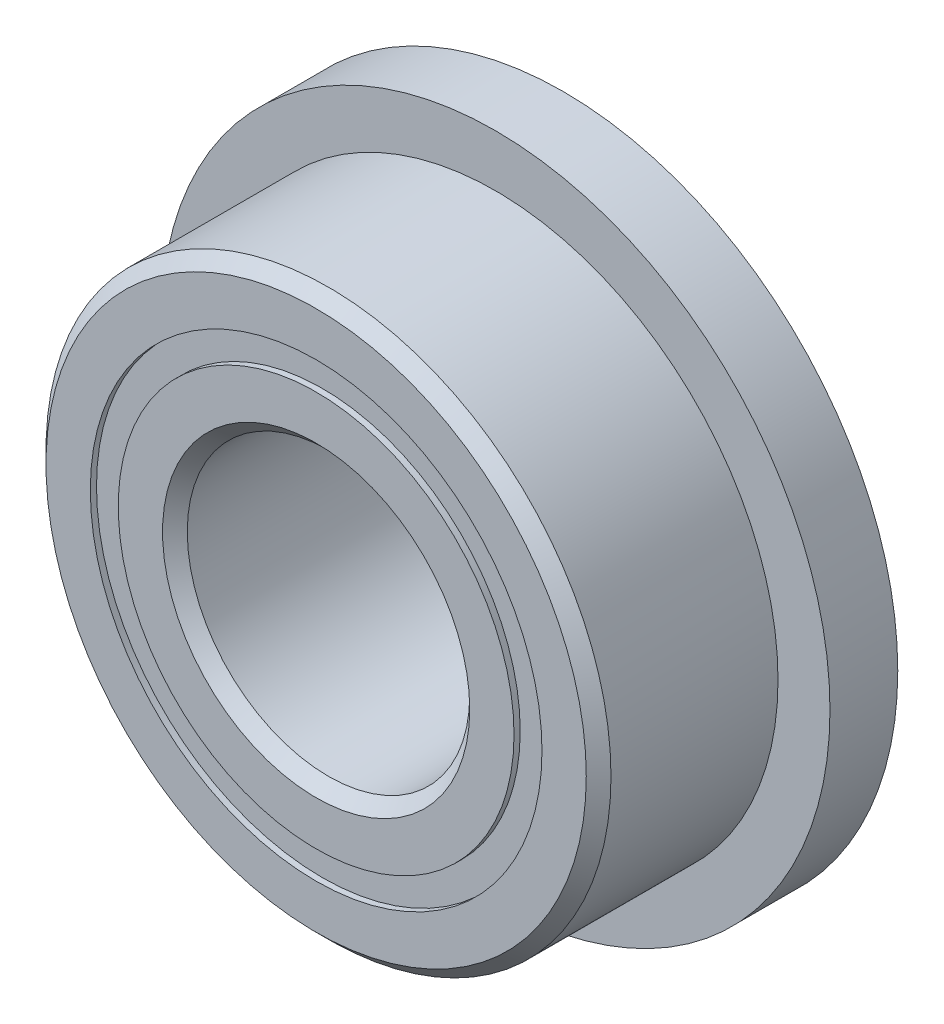
ISO-10303-21;
HEADER;
FILE_DESCRIPTION(('STEP AP214'),'2;1');
FILE_NAME('part.step','',(''),(''),'','','');
FILE_SCHEMA(('AUTOMOTIVE_DESIGN { 1 0 10303 214 1 1 1 1 }'));
ENDSEC;
DATA;
#1=APPLICATION_CONTEXT('core data for automotive mechanical design processes');
#2=APPLICATION_PROTOCOL_DEFINITION('international standard','automotive_design',2000,#1);
#3=PRODUCT_CONTEXT('',#1,'mechanical');
#4=PRODUCT('Part','Part','',(#3));
#5=PRODUCT_RELATED_PRODUCT_CATEGORY('part','',(#4));
#6=PRODUCT_DEFINITION_FORMATION('','',#4);
#7=PRODUCT_DEFINITION_CONTEXT('part definition',#1,'design');
#8=PRODUCT_DEFINITION('design','',#6,#7);
#9=PRODUCT_DEFINITION_SHAPE('','',#8);
#10=(LENGTH_UNIT() NAMED_UNIT(*) SI_UNIT(.MILLI.,.METRE.));
#11=(NAMED_UNIT(*) PLANE_ANGLE_UNIT() SI_UNIT($,.RADIAN.));
#12=(NAMED_UNIT(*) SI_UNIT($,.STERADIAN.) SOLID_ANGLE_UNIT());
#13=UNCERTAINTY_MEASURE_WITH_UNIT(LENGTH_MEASURE(1.E-05),#10,'distance_accuracy_value','');
#14=(GEOMETRIC_REPRESENTATION_CONTEXT(3) GLOBAL_UNCERTAINTY_ASSIGNED_CONTEXT((#13)) GLOBAL_UNIT_ASSIGNED_CONTEXT((#10,
#11,#12)) REPRESENTATION_CONTEXT('',''));
#15=CARTESIAN_POINT('',(0.,0.,0.));
#16=DIRECTION('',(0.,0.,1.));
#17=DIRECTION('',(1.,0.,0.));
#18=AXIS2_PLACEMENT_3D('',#15,#16,#17);
#19=CARTESIAN_POINT('',(0.,2.53825549450549,-1.319609375));
#20=DIRECTION('',(0.,0.,1.));
#21=DIRECTION('',(1.,0.,0.));
#22=AXIS2_PLACEMENT_3D('',#19,#20,#21);
#23=PLANE('',#22);
#24=CARTESIAN_POINT('',(0.,0.,-1.319609375));
#25=DIRECTION('',(0.,0.,1.));
#26=DIRECTION('',(1.,0.,0.));
#27=AXIS2_PLACEMENT_3D('',#24,#25,#26);
#28=CIRCLE('',#27,2.53825549450549);
#29=CARTESIAN_POINT('',(2.53825549450549,0.,-1.319609375));
#30=VERTEX_POINT('',#29);
#31=EDGE_CURVE('E64',#30,#30,#28,.T.);
#32=ORIENTED_EDGE('',*,*,#31,.F.);
#33=EDGE_LOOP('',(#32));
#34=FACE_BOUND('',#33,.T.);
#35=CARTESIAN_POINT('',(0.,0.,-1.319609375));
#36=DIRECTION('',(0.,0.,1.));
#37=DIRECTION('',(1.,0.,0.));
#38=AXIS2_PLACEMENT_3D('',#35,#36,#37);
#39=CIRCLE('',#38,2.2242445054945);
#40=CARTESIAN_POINT('',(2.2242445054945,0.,-1.319609375));
#41=VERTEX_POINT('',#40);
#42=EDGE_CURVE('E11',#41,#41,#39,.T.);
#43=ORIENTED_EDGE('',*,*,#42,.T.);
#44=EDGE_LOOP('',(#43));
#45=FACE_BOUND('',#44,.T.);
#46=ADVANCED_FACE('F50',(#34,#45),#23,.F.);
#47=CARTESIAN_POINT('',(0.,0.,1.3890625));
#48=DIRECTION('',(0.,0.,1.));
#49=DIRECTION('',(1.,0.,0.));
#50=AXIS2_PLACEMENT_3D('',#47,#48,#49);
#51=CYLINDRICAL_SURFACE('',#50,2.2242445054945);
#52=ORIENTED_EDGE('',*,*,#42,.F.);
#53=EDGE_LOOP('',(#52));
#54=FACE_BOUND('',#53,.T.);
#55=CARTESIAN_POINT('',(0.,0.,-0.637012925157144));
#56=DIRECTION('',(0.,0.,1.));
#57=DIRECTION('',(1.,0.,0.));
#58=AXIS2_PLACEMENT_3D('',#55,#56,#57);
#59=CIRCLE('',#58,2.2242445054945);
#60=CARTESIAN_POINT('',(2.2242445054945,0.,-0.637012925157144));
#61=VERTEX_POINT('',#60);
#62=EDGE_CURVE('E56',#61,#61,#59,.T.);
#63=ORIENTED_EDGE('',*,*,#62,.T.);
#64=EDGE_LOOP('',(#63));
#65=FACE_BOUND('',#64,.T.);
#66=ADVANCED_FACE('F73',(#54,#65),#51,.F.);
#67=CARTESIAN_POINT('',(0.,2.53825549450549,-0.637012925157144));
#68=DIRECTION('',(0.,0.,-1.));
#69=DIRECTION('',(-1.,0.,0.));
#70=AXIS2_PLACEMENT_3D('',#67,#68,#69);
#71=PLANE('',#70);
#72=ORIENTED_EDGE('',*,*,#62,.F.);
#73=EDGE_LOOP('',(#72));
#74=FACE_BOUND('',#73,.T.);
#75=CARTESIAN_POINT('',(0.,0.,-0.637012925157144));
#76=DIRECTION('',(0.,0.,1.));
#77=DIRECTION('',(1.,0.,0.));
#78=AXIS2_PLACEMENT_3D('',#75,#76,#77);
#79=CIRCLE('',#78,2.53825549450549);
#80=CARTESIAN_POINT('',(2.53825549450549,0.,-0.637012925157144));
#81=VERTEX_POINT('',#80);
#82=EDGE_CURVE('E60',#81,#81,#79,.T.);
#83=ORIENTED_EDGE('',*,*,#82,.T.);
#84=EDGE_LOOP('',(#83));
#85=FACE_BOUND('',#84,.T.);
#86=ADVANCED_FACE('F77',(#74,#85),#71,.F.);
#87=CARTESIAN_POINT('',(0.,0.,1.3890625));
#88=DIRECTION('',(0.,0.,1.));
#89=DIRECTION('',(1.,0.,0.));
#90=AXIS2_PLACEMENT_3D('',#87,#88,#89);
#91=CYLINDRICAL_SURFACE('',#90,2.53825549450549);
#92=ORIENTED_EDGE('',*,*,#82,.F.);
#93=EDGE_LOOP('',(#92));
#94=FACE_BOUND('',#93,.T.);
#95=ORIENTED_EDGE('',*,*,#31,.T.);
#96=EDGE_LOOP('',(#95));
#97=FACE_BOUND('',#96,.T.);
#98=ADVANCED_FACE('F70',(#94,#97),#91,.T.);
#99=CLOSED_SHELL('',(#46,#66,#86,#98));
#100=MANIFOLD_SOLID_BREP('B2',#99);
#101=CARTESIAN_POINT('',(0.,2.53825549450549,1.319609375));
#102=DIRECTION('',(0.,0.,-1.));
#103=DIRECTION('',(-1.,0.,0.));
#104=AXIS2_PLACEMENT_3D('',#101,#102,#103);
#105=PLANE('',#104);
#106=CARTESIAN_POINT('',(0.,0.,1.319609375));
#107=DIRECTION('',(0.,0.,1.));
#108=DIRECTION('',(1.,0.,0.));
#109=AXIS2_PLACEMENT_3D('',#106,#107,#108);
#110=CIRCLE('',#109,2.2242445054945);
#111=CARTESIAN_POINT('',(2.2242445054945,0.,1.319609375));
#112=VERTEX_POINT('',#111);
#113=EDGE_CURVE('E49',#112,#112,#110,.T.);
#114=ORIENTED_EDGE('',*,*,#113,.F.);
#115=EDGE_LOOP('',(#114));
#116=FACE_BOUND('',#115,.T.);
#117=CARTESIAN_POINT('',(0.,0.,1.319609375));
#118=DIRECTION('',(0.,0.,1.));
#119=DIRECTION('',(1.,0.,0.));
#120=AXIS2_PLACEMENT_3D('',#117,#118,#119);
#121=CIRCLE('',#120,2.53825549450549);
#122=CARTESIAN_POINT('',(2.53825549450549,0.,1.319609375));
#123=VERTEX_POINT('',#122);
#124=EDGE_CURVE('E124',#123,#123,#121,.T.);
#125=ORIENTED_EDGE('',*,*,#124,.T.);
#126=EDGE_LOOP('',(#125));
#127=FACE_BOUND('',#126,.T.);
#128=ADVANCED_FACE('F110',(#116,#127),#105,.F.);
#129=CARTESIAN_POINT('',(0.,0.,1.3890625));
#130=DIRECTION('',(0.,0.,1.));
#131=DIRECTION('',(1.,0.,0.));
#132=AXIS2_PLACEMENT_3D('',#129,#130,#131);
#133=CYLINDRICAL_SURFACE('',#132,2.2242445054945);
#134=CARTESIAN_POINT('',(0.,0.,0.637012925157144));
#135=DIRECTION('',(0.,0.,1.));
#136=DIRECTION('',(1.,0.,0.));
#137=AXIS2_PLACEMENT_3D('',#134,#135,#136);
#138=CIRCLE('',#137,2.2242445054945);
#139=CARTESIAN_POINT('',(2.2242445054945,0.,0.637012925157144));
#140=VERTEX_POINT('',#139);
#141=EDGE_CURVE('E116',#140,#140,#138,.T.);
#142=ORIENTED_EDGE('',*,*,#141,.F.);
#143=EDGE_LOOP('',(#142));
#144=FACE_BOUND('',#143,.T.);
#145=ORIENTED_EDGE('',*,*,#113,.T.);
#146=EDGE_LOOP('',(#145));
#147=FACE_BOUND('',#146,.T.);
#148=ADVANCED_FACE('F139',(#144,#147),#133,.F.);
#149=CARTESIAN_POINT('',(0.,2.53825549450549,0.637012925157144));
#150=DIRECTION('',(0.,0.,1.));
#151=DIRECTION('',(1.,0.,0.));
#152=AXIS2_PLACEMENT_3D('',#149,#150,#151);
#153=PLANE('',#152);
#154=CARTESIAN_POINT('',(0.,0.,0.637012925157144));
#155=DIRECTION('',(0.,0.,1.));
#156=DIRECTION('',(1.,0.,0.));
#157=AXIS2_PLACEMENT_3D('',#154,#155,#156);
#158=CIRCLE('',#157,2.53825549450549);
#159=CARTESIAN_POINT('',(2.53825549450549,0.,0.637012925157144));
#160=VERTEX_POINT('',#159);
#161=EDGE_CURVE('E120',#160,#160,#158,.T.);
#162=ORIENTED_EDGE('',*,*,#161,.F.);
#163=EDGE_LOOP('',(#162));
#164=FACE_BOUND('',#163,.T.);
#165=ORIENTED_EDGE('',*,*,#141,.T.);
#166=EDGE_LOOP('',(#165));
#167=FACE_BOUND('',#166,.T.);
#168=ADVANCED_FACE('F134',(#164,#167),#153,.F.);
#169=CARTESIAN_POINT('',(0.,0.,1.3890625));
#170=DIRECTION('',(0.,0.,1.));
#171=DIRECTION('',(1.,0.,0.));
#172=AXIS2_PLACEMENT_3D('',#169,#170,#171);
#173=CYLINDRICAL_SURFACE('',#172,2.53825549450549);
#174=ORIENTED_EDGE('',*,*,#124,.F.);
#175=EDGE_LOOP('',(#174));
#176=FACE_BOUND('',#175,.T.);
#177=ORIENTED_EDGE('',*,*,#161,.T.);
#178=EDGE_LOOP('',(#177));
#179=FACE_BOUND('',#178,.T.);
#180=ADVANCED_FACE('F131',(#176,#179),#173,.T.);
#181=CLOSED_SHELL('',(#128,#148,#168,#180));
#182=MANIFOLD_SOLID_BREP('B6',#181);
#183=CARTESIAN_POINT('',(-1.39966363202143,1.92647171785536,0.));
#184=DIRECTION('',(0.,0.,1.));
#185=DIRECTION('',(-0.587785252292462,0.809016994374955,0.));
#186=AXIS2_PLACEMENT_3D('',#183,#184,#185);
#187=SPHERICAL_SURFACE('',#186,0.637012925157144);
#188=CARTESIAN_POINT('',(-1.39966363202143,1.92647171785536,0.637012925157143));
#189=VERTEX_POINT('',#188);
#190=VERTEX_LOOP('',#189);
#191=FACE_BOUND('',#190,.T.);
#192=ADVANCED_FACE('F170',(#191),#187,.T.);
#193=CLOSED_SHELL('',(#192));
#194=MANIFOLD_SOLID_BREP('B44',#193);
#195=CARTESIAN_POINT('',(-2.26470332942782,0.735846717855369,0.));
#196=DIRECTION('',(0.,0.,1.));
#197=DIRECTION('',(-0.95105651629515,0.309016994374958,0.));
#198=AXIS2_PLACEMENT_3D('',#195,#196,#197);
#199=SPHERICAL_SURFACE('',#198,0.637012925157144);
#200=CARTESIAN_POINT('',(-2.26470332942782,0.735846717855369,0.637012925157143));
#201=VERTEX_POINT('',#200);
#202=VERTEX_LOOP('',#201);
#203=FACE_BOUND('',#202,.T.);
#204=ADVANCED_FACE('F193',(#203),#199,.T.);
#205=CLOSED_SHELL('',(#204));
#206=MANIFOLD_SOLID_BREP('B106',#205);
#207=CARTESIAN_POINT('',(-2.26470332942784,-0.735846717855321,0.));
#208=DIRECTION('',(0.,0.,1.));
#209=DIRECTION('',(-0.951056516295157,-0.309016994374938,0.));
#210=AXIS2_PLACEMENT_3D('',#207,#208,#209);
#211=SPHERICAL_SURFACE('',#210,0.637012925157144);
#212=CARTESIAN_POINT('',(-2.26470332942784,-0.735846717855321,0.637012925157143));
#213=VERTEX_POINT('',#212);
#214=VERTEX_LOOP('',#213);
#215=FACE_BOUND('',#214,.T.);
#216=ADVANCED_FACE('F216',(#215),#211,.T.);
#217=CLOSED_SHELL('',(#216));
#218=MANIFOLD_SOLID_BREP('B166',#217);
#219=CARTESIAN_POINT('',(-1.39966363202147,-1.92647171785533,0.));
#220=DIRECTION('',(0.,0.,1.));
#221=DIRECTION('',(-0.58778525229248,-0.809016994374942,0.));
#222=AXIS2_PLACEMENT_3D('',#219,#220,#221);
#223=SPHERICAL_SURFACE('',#222,0.637012925157144);
#224=CARTESIAN_POINT('',(-1.39966363202147,-1.92647171785533,0.637012925157143));
#225=VERTEX_POINT('',#224);
#226=VERTEX_LOOP('',#225);
#227=FACE_BOUND('',#226,.T.);
#228=ADVANCED_FACE('F239',(#227),#223,.T.);
#229=CLOSED_SHELL('',(#228));
#230=MANIFOLD_SOLID_BREP('B189',#229);
#231=CARTESIAN_POINT('',(0.,-2.38125,0.));
#232=DIRECTION('',(0.,0.,1.));
#233=DIRECTION('',(0.,-1.,0.));
#234=AXIS2_PLACEMENT_3D('',#231,#232,#233);
#235=SPHERICAL_SURFACE('',#234,0.637012925157144);
#236=CARTESIAN_POINT('',(0.,-2.38125,0.637012925157143));
#237=VERTEX_POINT('',#236);
#238=VERTEX_LOOP('',#237);
#239=FACE_BOUND('',#238,.T.);
#240=ADVANCED_FACE('F262',(#239),#235,.T.);
#241=CLOSED_SHELL('',(#240));
#242=MANIFOLD_SOLID_BREP('B212',#241);
#243=CARTESIAN_POINT('',(1.39966363202144,-1.92647171785535,0.));
#244=DIRECTION('',(0.,0.,1.));
#245=DIRECTION('',(0.587785252292469,-0.809016994374951,0.));
#246=AXIS2_PLACEMENT_3D('',#243,#244,#245);
#247=SPHERICAL_SURFACE('',#246,0.637012925157144);
#248=CARTESIAN_POINT('',(1.39966363202144,-1.92647171785535,0.637012925157143));
#249=VERTEX_POINT('',#248);
#250=VERTEX_LOOP('',#249);
#251=FACE_BOUND('',#250,.T.);
#252=ADVANCED_FACE('F285',(#251),#247,.T.);
#253=CLOSED_SHELL('',(#252));
#254=MANIFOLD_SOLID_BREP('B235',#253);
#255=CARTESIAN_POINT('',(2.26470332942783,-0.735846717855353,0.));
#256=DIRECTION('',(0.,0.,1.));
#257=DIRECTION('',(0.951056516295152,-0.309016994374952,0.));
#258=AXIS2_PLACEMENT_3D('',#255,#256,#257);
#259=SPHERICAL_SURFACE('',#258,0.637012925157144);
#260=CARTESIAN_POINT('',(2.26470332942783,-0.735846717855353,0.637012925157143));
#261=VERTEX_POINT('',#260);
#262=VERTEX_LOOP('',#261);
#263=FACE_BOUND('',#262,.T.);
#264=ADVANCED_FACE('F308',(#263),#259,.T.);
#265=CLOSED_SHELL('',(#264));
#266=MANIFOLD_SOLID_BREP('B258',#265);
#267=CARTESIAN_POINT('',(2.26470332942784,0.735846717855337,0.));
#268=DIRECTION('',(0.,0.,1.));
#269=DIRECTION('',(0.951056516295155,0.309016994374945,0.));
#270=AXIS2_PLACEMENT_3D('',#267,#268,#269);
#271=SPHERICAL_SURFACE('',#270,0.637012925157144);
#272=CARTESIAN_POINT('',(2.26470332942784,0.735846717855337,0.637012925157143));
#273=VERTEX_POINT('',#272);
#274=VERTEX_LOOP('',#273);
#275=FACE_BOUND('',#274,.T.);
#276=ADVANCED_FACE('F331',(#275),#271,.T.);
#277=CLOSED_SHELL('',(#276));
#278=MANIFOLD_SOLID_BREP('B281',#277);
#279=CARTESIAN_POINT('',(1.39966363202145,1.92647171785534,0.));
#280=DIRECTION('',(0.,0.,1.));
#281=DIRECTION('',(0.587785252292474,0.809016994374947,0.));
#282=AXIS2_PLACEMENT_3D('',#279,#280,#281);
#283=SPHERICAL_SURFACE('',#282,0.637012925157144);
#284=CARTESIAN_POINT('',(1.39966363202145,1.92647171785534,0.637012925157143));
#285=VERTEX_POINT('',#284);
#286=VERTEX_LOOP('',#285);
#287=FACE_BOUND('',#286,.T.);
#288=ADVANCED_FACE('F354',(#287),#283,.T.);
#289=CLOSED_SHELL('',(#288));
#290=MANIFOLD_SOLID_BREP('B304',#289);
#291=CARTESIAN_POINT('',(0.,2.38125,0.));
#292=DIRECTION('',(0.,0.,1.));
#293=DIRECTION('',(0.,1.,0.));
#294=AXIS2_PLACEMENT_3D('',#291,#292,#293);
#295=SPHERICAL_SURFACE('',#294,0.637012925157144);
#296=CARTESIAN_POINT('',(0.,2.38125,0.637012925157143));
#297=VERTEX_POINT('',#296);
#298=VERTEX_LOOP('',#297);
#299=FACE_BOUND('',#298,.T.);
#300=ADVANCED_FACE('F379',(#299),#295,.T.);
#301=CLOSED_SHELL('',(#300));
#302=MANIFOLD_SOLID_BREP('B327',#301);
#303=CARTESIAN_POINT('',(0.,2.2242445054945,1.3890625));
#304=DIRECTION('',(0.,0.,-1.));
#305=DIRECTION('',(-1.,0.,0.));
#306=AXIS2_PLACEMENT_3D('',#303,#304,#305);
#307=PLANE('',#306);
#308=CARTESIAN_POINT('',(0.,0.,1.3890625));
#309=DIRECTION('',(0.,0.,1.));
#310=DIRECTION('',(1.,0.,0.));
#311=AXIS2_PLACEMENT_3D('',#308,#309,#310);
#312=CIRCLE('',#311,1.72640625);
#313=CARTESIAN_POINT('',(1.72640625,0.,1.3890625));
#314=VERTEX_POINT('',#313);
#315=EDGE_CURVE('E425',#314,#314,#312,.T.);
#316=ORIENTED_EDGE('',*,*,#315,.F.);
#317=EDGE_LOOP('',(#316));
#318=FACE_BOUND('',#317,.T.);
#319=CARTESIAN_POINT('',(0.,0.,1.3890625));
#320=DIRECTION('',(0.,0.,1.));
#321=DIRECTION('',(1.,0.,0.));
#322=AXIS2_PLACEMENT_3D('',#319,#320,#321);
#323=CIRCLE('',#322,2.2242445054945);
#324=CARTESIAN_POINT('',(2.2242445054945,0.,1.3890625));
#325=VERTEX_POINT('',#324);
#326=EDGE_CURVE('E378',#325,#325,#323,.T.);
#327=ORIENTED_EDGE('',*,*,#326,.T.);
#328=EDGE_LOOP('',(#327));
#329=FACE_BOUND('',#328,.T.);
#330=ADVANCED_FACE('F397',(#318,#329),#307,.F.);
#331=CARTESIAN_POINT('',(0.,0.,1.3890625));
#332=DIRECTION('',(0.,0.,1.));
#333=DIRECTION('',(1.,0.,0.));
#334=AXIS2_PLACEMENT_3D('',#331,#332,#333);
#335=CYLINDRICAL_SURFACE('',#334,2.2242445054945);
#336=ORIENTED_EDGE('',*,*,#326,.F.);
#337=EDGE_LOOP('',(#336));
#338=FACE_BOUND('',#337,.T.);
#339=CARTESIAN_POINT('',(0.,0.,0.617361111111111));
#340=DIRECTION('',(0.,0.,1.));
#341=DIRECTION('',(1.,0.,0.));
#342=AXIS2_PLACEMENT_3D('',#339,#340,#341);
#343=CIRCLE('',#342,2.2242445054945);
#344=CARTESIAN_POINT('',(2.2242445054945,0.,0.617361111111111));
#345=VERTEX_POINT('',#344);
#346=EDGE_CURVE('E403',#345,#345,#343,.T.);
#347=ORIENTED_EDGE('',*,*,#346,.T.);
#348=EDGE_LOOP('',(#347));
#349=FACE_BOUND('',#348,.T.);
#350=ADVANCED_FACE('F432',(#338,#349),#335,.T.);
#351=CARTESIAN_POINT('',(0.,0.,0.));
#352=DIRECTION('',(0.,0.,1.));
#353=DIRECTION('',(1.,0.,0.));
#354=AXIS2_PLACEMENT_3D('',#351,#352,#353);
#355=TOROIDAL_SURFACE('',#354,2.38125,0.637012925157143);
#356=ORIENTED_EDGE('',*,*,#346,.F.);
#357=EDGE_LOOP('',(#356));
#358=FACE_BOUND('',#357,.T.);
#359=CARTESIAN_POINT('',(0.,0.,-0.617361111111111));
#360=DIRECTION('',(0.,0.,1.));
#361=DIRECTION('',(1.,0.,0.));
#362=AXIS2_PLACEMENT_3D('',#359,#360,#361);
#363=CIRCLE('',#362,2.2242445054945);
#364=CARTESIAN_POINT('',(2.2242445054945,0.,-0.617361111111111));
#365=VERTEX_POINT('',#364);
#366=EDGE_CURVE('E407',#365,#365,#363,.T.);
#367=ORIENTED_EDGE('',*,*,#366,.T.);
#368=EDGE_LOOP('',(#367));
#369=FACE_BOUND('',#368,.T.);
#370=ADVANCED_FACE('F436',(#358,#369),#355,.F.);
#371=CARTESIAN_POINT('',(0.,0.,1.3890625));
#372=DIRECTION('',(0.,0.,1.));
#373=DIRECTION('',(1.,0.,0.));
#374=AXIS2_PLACEMENT_3D('',#371,#372,#373);
#375=CYLINDRICAL_SURFACE('',#374,2.2242445054945);
#376=ORIENTED_EDGE('',*,*,#366,.F.);
#377=EDGE_LOOP('',(#376));
#378=FACE_BOUND('',#377,.T.);
#379=CARTESIAN_POINT('',(0.,0.,-1.3890625));
#380=DIRECTION('',(0.,0.,1.));
#381=DIRECTION('',(1.,0.,0.));
#382=AXIS2_PLACEMENT_3D('',#379,#380,#381);
#383=CIRCLE('',#382,2.2242445054945);
#384=CARTESIAN_POINT('',(2.2242445054945,0.,-1.3890625));
#385=VERTEX_POINT('',#384);
#386=EDGE_CURVE('E411',#385,#385,#383,.T.);
#387=ORIENTED_EDGE('',*,*,#386,.T.);
#388=EDGE_LOOP('',(#387));
#389=FACE_BOUND('',#388,.T.);
#390=ADVANCED_FACE('F441',(#378,#389),#375,.T.);
#391=CARTESIAN_POINT('',(0.,1.72640625,-1.3890625));
#392=DIRECTION('',(0.,0.,1.));
#393=DIRECTION('',(1.,0.,0.));
#394=AXIS2_PLACEMENT_3D('',#391,#392,#393);
#395=PLANE('',#394);
#396=ORIENTED_EDGE('',*,*,#386,.F.);
#397=EDGE_LOOP('',(#396));
#398=FACE_BOUND('',#397,.T.);
#399=CARTESIAN_POINT('',(0.,0.,-1.3890625));
#400=DIRECTION('',(0.,0.,1.));
#401=DIRECTION('',(1.,0.,0.));
#402=AXIS2_PLACEMENT_3D('',#399,#400,#401);
#403=CIRCLE('',#402,1.72640625);
#404=CARTESIAN_POINT('',(1.72640625,0.,-1.3890625));
#405=VERTEX_POINT('',#404);
#406=EDGE_CURVE('E416',#405,#405,#403,.T.);
#407=ORIENTED_EDGE('',*,*,#406,.T.);
#408=EDGE_LOOP('',(#407));
#409=FACE_BOUND('',#408,.T.);
#410=ADVANCED_FACE('F447',(#398,#409),#395,.F.);
#411=CARTESIAN_POINT('',(0.,0.,-1.25015625));
#412=DIRECTION('',(0.,0.,-1.));
#413=DIRECTION('',(-1.,0.,0.));
#414=AXIS2_PLACEMENT_3D('',#411,#412,#413);
#415=CONICAL_SURFACE('',#414,1.5875,0.785398163397446);
#416=ORIENTED_EDGE('',*,*,#406,.F.);
#417=EDGE_LOOP('',(#416));
#418=FACE_BOUND('',#417,.T.);
#419=CARTESIAN_POINT('',(0.,0.,-1.25015625));
#420=DIRECTION('',(0.,0.,1.));
#421=DIRECTION('',(1.,0.,0.));
#422=AXIS2_PLACEMENT_3D('',#419,#420,#421);
#423=CIRCLE('',#422,1.5875);
#424=CARTESIAN_POINT('',(1.5875,0.,-1.25015625));
#425=VERTEX_POINT('',#424);
#426=EDGE_CURVE('E419',#425,#425,#423,.T.);
#427=ORIENTED_EDGE('',*,*,#426,.T.);
#428=EDGE_LOOP('',(#427));
#429=FACE_BOUND('',#428,.T.);
#430=ADVANCED_FACE('F451',(#418,#429),#415,.F.);
#431=CARTESIAN_POINT('',(0.,0.,1.3890625));
#432=DIRECTION('',(0.,0.,1.));
#433=DIRECTION('',(1.,0.,0.));
#434=AXIS2_PLACEMENT_3D('',#431,#432,#433);
#435=CYLINDRICAL_SURFACE('',#434,1.5875);
#436=ORIENTED_EDGE('',*,*,#426,.F.);
#437=EDGE_LOOP('',(#436));
#438=FACE_BOUND('',#437,.T.);
#439=CARTESIAN_POINT('',(0.,0.,1.25015625));
#440=DIRECTION('',(0.,0.,1.));
#441=DIRECTION('',(1.,0.,0.));
#442=AXIS2_PLACEMENT_3D('',#439,#440,#441);
#443=CIRCLE('',#442,1.5875);
#444=CARTESIAN_POINT('',(1.5875,0.,1.25015625));
#445=VERTEX_POINT('',#444);
#446=EDGE_CURVE('E422',#445,#445,#443,.T.);
#447=ORIENTED_EDGE('',*,*,#446,.T.);
#448=EDGE_LOOP('',(#447));
#449=FACE_BOUND('',#448,.T.);
#450=ADVANCED_FACE('F455',(#438,#449),#435,.F.);
#451=CARTESIAN_POINT('',(0.,0.,1.3890625));
#452=DIRECTION('',(0.,0.,1.));
#453=DIRECTION('',(1.,0.,0.));
#454=AXIS2_PLACEMENT_3D('',#451,#452,#453);
#455=CONICAL_SURFACE('',#454,1.72640625,0.785398163397449);
#456=ORIENTED_EDGE('',*,*,#446,.F.);
#457=EDGE_LOOP('',(#456));
#458=FACE_BOUND('',#457,.T.);
#459=ORIENTED_EDGE('',*,*,#315,.T.);
#460=EDGE_LOOP('',(#459));
#461=FACE_BOUND('',#460,.T.);
#462=ADVANCED_FACE('F429',(#458,#461),#455,.F.);
#463=CLOSED_SHELL('',(#330,#350,#370,#390,#410,#430,#450,#462));
#464=MANIFOLD_SOLID_BREP('B350',#463);
#465=CARTESIAN_POINT('',(0.,0.,1.25015625));
#466=DIRECTION('',(0.,0.,-1.));
#467=DIRECTION('',(-1.,0.,0.));
#468=AXIS2_PLACEMENT_3D('',#465,#466,#467);
#469=CONICAL_SURFACE('',#468,3.175,0.785398163397448);
#470=CARTESIAN_POINT('',(0.,0.,1.3890625));
#471=DIRECTION('',(0.,0.,1.));
#472=DIRECTION('',(1.,0.,0.));
#473=AXIS2_PLACEMENT_3D('',#470,#471,#472);
#474=CIRCLE('',#473,3.03609375);
#475=CARTESIAN_POINT('',(3.03609375,0.,1.3890625));
#476=VERTEX_POINT('',#475);
#477=EDGE_CURVE('E525',#476,#476,#474,.T.);
#478=ORIENTED_EDGE('',*,*,#477,.F.);
#479=EDGE_LOOP('',(#478));
#480=FACE_BOUND('',#479,.T.);
#481=CARTESIAN_POINT('',(0.,0.,1.25015625));
#482=DIRECTION('',(0.,0.,1.));
#483=DIRECTION('',(1.,0.,0.));
#484=AXIS2_PLACEMENT_3D('',#481,#482,#483);
#485=CIRCLE('',#484,3.175);
#486=CARTESIAN_POINT('',(3.175,0.,1.25015625));
#487=VERTEX_POINT('',#486);
#488=EDGE_CURVE('E396',#487,#487,#485,.T.);
#489=ORIENTED_EDGE('',*,*,#488,.T.);
#490=EDGE_LOOP('',(#489));
#491=FACE_BOUND('',#490,.T.);
#492=ADVANCED_FACE('F503',(#480,#491),#469,.T.);
#493=CARTESIAN_POINT('',(0.,0.,1.3890625));
#494=DIRECTION('',(0.,0.,1.));
#495=DIRECTION('',(1.,0.,0.));
#496=AXIS2_PLACEMENT_3D('',#493,#494,#495);
#497=CYLINDRICAL_SURFACE('',#496,3.175);
#498=CARTESIAN_POINT('',(0.,0.,-0.627062499999999));
#499=DIRECTION('',(0.,0.,1.));
#500=DIRECTION('',(1.,0.,0.));
#501=AXIS2_PLACEMENT_3D('',#498,#499,#500);
#502=CIRCLE('',#501,3.175);
#503=CARTESIAN_POINT('',(3.175,0.,-0.627062499999999));
#504=VERTEX_POINT('',#503);
#505=EDGE_CURVE('E528',#504,#504,#502,.T.);
#506=ORIENTED_EDGE('',*,*,#505,.T.);
#507=EDGE_LOOP('',(#506));
#508=FACE_BOUND('',#507,.T.);
#509=ORIENTED_EDGE('',*,*,#488,.F.);
#510=EDGE_LOOP('',(#509));
#511=FACE_BOUND('',#510,.T.);
#512=ADVANCED_FACE('F548',(#508,#511),#497,.T.);
#513=CARTESIAN_POINT('',(0.,3.03609375,-1.3890625));
#514=DIRECTION('',(0.,0.,1.));
#515=DIRECTION('',(1.,0.,0.));
#516=AXIS2_PLACEMENT_3D('',#513,#514,#515);
#517=PLANE('',#516);
#518=CARTESIAN_POINT('',(0.,0.,-1.3890625));
#519=DIRECTION('',(0.,0.,1.));
#520=DIRECTION('',(1.,0.,0.));
#521=AXIS2_PLACEMENT_3D('',#518,#519,#520);
#522=CIRCLE('',#521,2.53825549450549);
#523=CARTESIAN_POINT('',(2.53825549450549,0.,-1.3890625));
#524=VERTEX_POINT('',#523);
#525=EDGE_CURVE('E509',#524,#524,#522,.T.);
#526=ORIENTED_EDGE('',*,*,#525,.T.);
#527=EDGE_LOOP('',(#526));
#528=FACE_BOUND('',#527,.T.);
#529=CARTESIAN_POINT('',(0.,0.,-1.3890625));
#530=DIRECTION('',(0.,0.,-1.));
#531=DIRECTION('',(-1.,0.,0.));
#532=AXIS2_PLACEMENT_3D('',#529,#530,#531);
#533=CIRCLE('',#532,3.7592);
#534=CARTESIAN_POINT('',(-3.7592,0.,-1.3890625));
#535=VERTEX_POINT('',#534);
#536=EDGE_CURVE('E531',#535,#535,#533,.T.);
#537=ORIENTED_EDGE('',*,*,#536,.T.);
#538=EDGE_LOOP('',(#537));
#539=FACE_BOUND('',#538,.T.);
#540=ADVANCED_FACE('F551',(#528,#539),#517,.F.);
#541=CARTESIAN_POINT('',(0.,0.,1.3890625));
#542=DIRECTION('',(0.,0.,1.));
#543=DIRECTION('',(1.,0.,0.));
#544=AXIS2_PLACEMENT_3D('',#541,#542,#543);
#545=CYLINDRICAL_SURFACE('',#544,2.53825549450549);
#546=CARTESIAN_POINT('',(0.,0.,-0.617361111111111));
#547=DIRECTION('',(0.,0.,1.));
#548=DIRECTION('',(1.,0.,0.));
#549=AXIS2_PLACEMENT_3D('',#546,#547,#548);
#550=CIRCLE('',#549,2.53825549450549);
#551=CARTESIAN_POINT('',(2.53825549450549,0.,-0.617361111111111));
#552=VERTEX_POINT('',#551);
#553=EDGE_CURVE('E513',#552,#552,#550,.T.);
#554=ORIENTED_EDGE('',*,*,#553,.T.);
#555=EDGE_LOOP('',(#554));
#556=FACE_BOUND('',#555,.T.);
#557=ORIENTED_EDGE('',*,*,#525,.F.);
#558=EDGE_LOOP('',(#557));
#559=FACE_BOUND('',#558,.T.);
#560=ADVANCED_FACE('F556',(#556,#559),#545,.F.);
#561=CARTESIAN_POINT('',(0.,0.,0.));
#562=DIRECTION('',(0.,0.,1.));
#563=DIRECTION('',(1.,0.,0.));
#564=AXIS2_PLACEMENT_3D('',#561,#562,#563);
#565=TOROIDAL_SURFACE('',#564,2.38125,0.637012925157144);
#566=ORIENTED_EDGE('',*,*,#553,.F.);
#567=EDGE_LOOP('',(#566));
#568=FACE_BOUND('',#567,.T.);
#569=CARTESIAN_POINT('',(0.,0.,0.617361111111111));
#570=DIRECTION('',(0.,0.,1.));
#571=DIRECTION('',(1.,0.,0.));
#572=AXIS2_PLACEMENT_3D('',#569,#570,#571);
#573=CIRCLE('',#572,2.53825549450549);
#574=CARTESIAN_POINT('',(2.53825549450549,0.,0.617361111111111));
#575=VERTEX_POINT('',#574);
#576=EDGE_CURVE('E517',#575,#575,#573,.T.);
#577=ORIENTED_EDGE('',*,*,#576,.T.);
#578=EDGE_LOOP('',(#577));
#579=FACE_BOUND('',#578,.T.);
#580=ADVANCED_FACE('F563',(#568,#579),#565,.F.);
#581=CARTESIAN_POINT('',(0.,0.,1.3890625));
#582=DIRECTION('',(0.,0.,1.));
#583=DIRECTION('',(1.,0.,0.));
#584=AXIS2_PLACEMENT_3D('',#581,#582,#583);
#585=CYLINDRICAL_SURFACE('',#584,2.53825549450549);
#586=ORIENTED_EDGE('',*,*,#576,.F.);
#587=EDGE_LOOP('',(#586));
#588=FACE_BOUND('',#587,.T.);
#589=CARTESIAN_POINT('',(0.,0.,1.3890625));
#590=DIRECTION('',(0.,0.,1.));
#591=DIRECTION('',(1.,0.,0.));
#592=AXIS2_PLACEMENT_3D('',#589,#590,#591);
#593=CIRCLE('',#592,2.53825549450549);
#594=CARTESIAN_POINT('',(2.53825549450549,0.,1.3890625));
#595=VERTEX_POINT('',#594);
#596=EDGE_CURVE('E522',#595,#595,#593,.T.);
#597=ORIENTED_EDGE('',*,*,#596,.T.);
#598=EDGE_LOOP('',(#597));
#599=FACE_BOUND('',#598,.T.);
#600=ADVANCED_FACE('F567',(#588,#599),#585,.F.);
#601=CARTESIAN_POINT('',(0.,3.03609375,1.3890625));
#602=DIRECTION('',(0.,0.,-1.));
#603=DIRECTION('',(-1.,0.,0.));
#604=AXIS2_PLACEMENT_3D('',#601,#602,#603);
#605=PLANE('',#604);
#606=ORIENTED_EDGE('',*,*,#596,.F.);
#607=EDGE_LOOP('',(#606));
#608=FACE_BOUND('',#607,.T.);
#609=ORIENTED_EDGE('',*,*,#477,.T.);
#610=EDGE_LOOP('',(#609));
#611=FACE_BOUND('',#610,.T.);
#612=ADVANCED_FACE('F544',(#608,#611),#605,.F.);
#613=CARTESIAN_POINT('',(0.,2.53825549450549,-0.627062499999999));
#614=DIRECTION('',(0.,0.,1.));
#615=DIRECTION('',(1.,0.,0.));
#616=AXIS2_PLACEMENT_3D('',#613,#614,#615);
#617=PLANE('',#616);
#618=CARTESIAN_POINT('',(0.,0.,-0.627062499999999));
#619=DIRECTION('',(0.,0.,-1.));
#620=DIRECTION('',(-1.,0.,0.));
#621=AXIS2_PLACEMENT_3D('',#618,#619,#620);
#622=CIRCLE('',#621,3.7592);
#623=CARTESIAN_POINT('',(-3.7592,0.,-0.627062499999999));
#624=VERTEX_POINT('',#623);
#625=EDGE_CURVE('E534',#624,#624,#622,.T.);
#626=ORIENTED_EDGE('',*,*,#625,.F.);
#627=EDGE_LOOP('',(#626));
#628=FACE_BOUND('',#627,.T.);
#629=ORIENTED_EDGE('',*,*,#505,.F.);
#630=EDGE_LOOP('',(#629));
#631=FACE_BOUND('',#630,.T.);
#632=ADVANCED_FACE('F541',(#628,#631),#617,.T.);
#633=CARTESIAN_POINT('',(0.,0.,-1.3890625));
#634=DIRECTION('',(0.,0.,-1.));
#635=DIRECTION('',(-1.,0.,0.));
#636=AXIS2_PLACEMENT_3D('',#633,#634,#635);
#637=CYLINDRICAL_SURFACE('',#636,3.7592);
#638=ORIENTED_EDGE('',*,*,#625,.T.);
#639=EDGE_LOOP('',(#638));
#640=FACE_BOUND('',#639,.T.);
#641=ORIENTED_EDGE('',*,*,#536,.F.);
#642=EDGE_LOOP('',(#641));
#643=FACE_BOUND('',#642,.T.);
#644=ADVANCED_FACE('F538',(#640,#643),#637,.T.);
#645=CLOSED_SHELL('',(#492,#512,#540,#560,#580,#600,#612,#632,#644));
#646=MANIFOLD_SOLID_BREP('B373',#645);
#647=ADVANCED_BREP_SHAPE_REPRESENTATION('',(#18,#100,#182,#194,#206,#218,#230,#242,#254,#266,
#278,#290,#302,#464,#646),#14);
#648=SHAPE_DEFINITION_REPRESENTATION(#9,#647);
ENDSEC;
END-ISO-10303-21;
